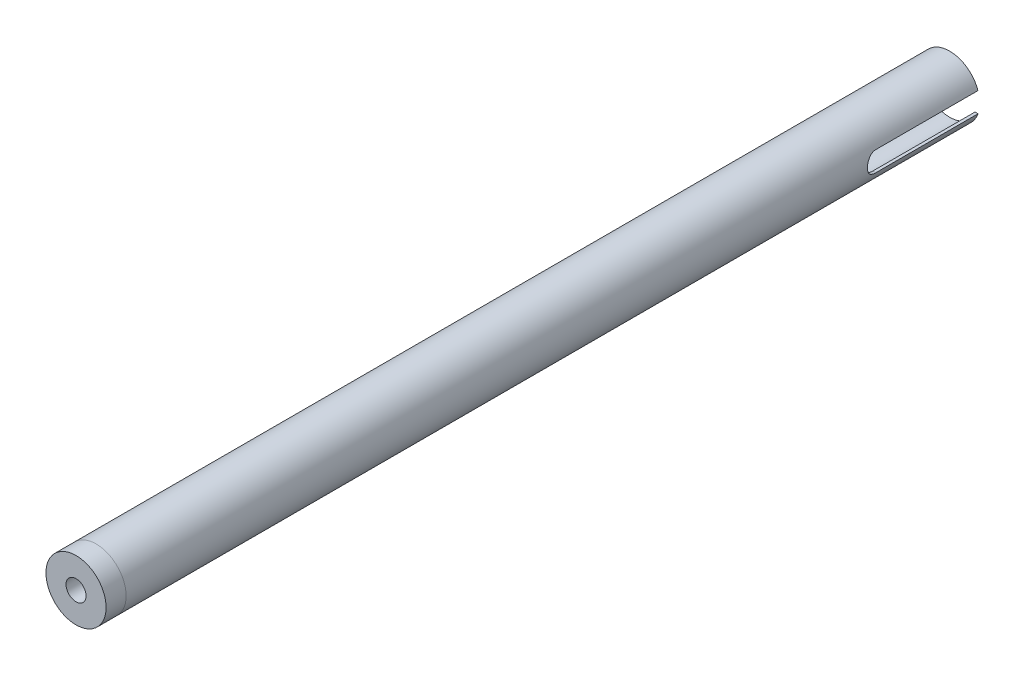
ISO-10303-21;
HEADER;
FILE_DESCRIPTION(('STEP AP214'),'2;1');
FILE_NAME('part.step','',(''),(''),'','','');
FILE_SCHEMA(('AUTOMOTIVE_DESIGN { 1 0 10303 214 1 1 1 1 }'));
ENDSEC;
DATA;
#1=APPLICATION_CONTEXT('core data for automotive mechanical design processes');
#2=APPLICATION_PROTOCOL_DEFINITION('international standard','automotive_design',2000,#1);
#3=PRODUCT_CONTEXT('',#1,'mechanical');
#4=PRODUCT('Part','Part','',(#3));
#5=PRODUCT_RELATED_PRODUCT_CATEGORY('part','',(#4));
#6=PRODUCT_DEFINITION_FORMATION('','',#4);
#7=PRODUCT_DEFINITION_CONTEXT('part definition',#1,'design');
#8=PRODUCT_DEFINITION('design','',#6,#7);
#9=PRODUCT_DEFINITION_SHAPE('','',#8);
#10=(LENGTH_UNIT() NAMED_UNIT(*) SI_UNIT(.MILLI.,.METRE.));
#11=(NAMED_UNIT(*) PLANE_ANGLE_UNIT() SI_UNIT($,.RADIAN.));
#12=(NAMED_UNIT(*) SI_UNIT($,.STERADIAN.) SOLID_ANGLE_UNIT());
#13=UNCERTAINTY_MEASURE_WITH_UNIT(LENGTH_MEASURE(1.E-05),#10,'distance_accuracy_value','');
#14=(GEOMETRIC_REPRESENTATION_CONTEXT(3) GLOBAL_UNCERTAINTY_ASSIGNED_CONTEXT((#13)) GLOBAL_UNIT_ASSIGNED_CONTEXT((#10,
#11,#12)) REPRESENTATION_CONTEXT('',''));
#15=CARTESIAN_POINT('',(0.,0.,0.));
#16=DIRECTION('',(0.,0.,1.));
#17=DIRECTION('',(1.,0.,0.));
#18=AXIS2_PLACEMENT_3D('',#15,#16,#17);
#19=CARTESIAN_POINT('',(0.,0.,-276.704034137088));
#20=DIRECTION('',(0.,0.,1.));
#21=DIRECTION('',(1.,0.,0.));
#22=AXIS2_PLACEMENT_3D('',#19,#20,#21);
#23=CYLINDRICAL_SURFACE('',#22,9.525);
#24=CARTESIAN_POINT('',(0.,0.,-6.35));
#25=DIRECTION('',(0.,0.,1.));
#26=DIRECTION('',(1.,0.,0.));
#27=AXIS2_PLACEMENT_3D('',#24,#25,#26);
#28=CIRCLE('',#27,9.525);
#29=CARTESIAN_POINT('',(9.525,0.,-6.35));
#30=VERTEX_POINT('',#29);
#31=EDGE_CURVE('E167',#30,#30,#28,.T.);
#32=ORIENTED_EDGE('',*,*,#31,.F.);
#33=EDGE_LOOP('',(#32));
#34=FACE_BOUND('',#33,.T.);
#35=CARTESIAN_POINT('',(-8.98025612106915,3.175,-244.319034137088));
#36=CARTESIAN_POINT('',(-8.98024230233901,3.17501142134308,-244.232408033752));
#37=CARTESIAN_POINT('',(-8.98150922759707,3.17145501317748,-244.145789651276));
#38=CARTESIAN_POINT('',(-8.98650170400112,3.1572955094353,-243.973224836451));
#39=CARTESIAN_POINT('',(-8.99022659113085,3.14669431699565,-243.887278228965));
#40=CARTESIAN_POINT('',(-9.00001740508998,3.11857670914846,-243.7169239878));
#41=CARTESIAN_POINT('',(-9.00607621805003,3.10108130380329,-243.632512485993));
#42=CARTESIAN_POINT('',(-9.02033586435303,3.05935434973545,-243.465577684657));
#43=CARTESIAN_POINT('',(-9.02853677497232,3.03512255799513,-243.383054453366));
#44=CARTESIAN_POINT('',(-9.05598792154067,2.95264369348964,-243.139255830089));
#45=CARTESIAN_POINT('',(-9.07810200713862,2.88457148458964,-242.981502245765));
#46=CARTESIAN_POINT('',(-9.127451360236,2.72437908867647,-242.679625727276));
#47=CARTESIAN_POINT('',(-9.15468995097455,2.63224328129309,-242.535511730048));
#48=CARTESIAN_POINT('',(-9.21240416673121,2.42269155952414,-242.259358870223));
#49=CARTESIAN_POINT('',(-9.24296008478943,2.30449853156512,-242.127925288361));
#50=CARTESIAN_POINT('',(-9.30318902123143,2.04784031127145,-241.886329992024));
#51=CARTESIAN_POINT('',(-9.33286185998227,1.90937102786996,-241.776172580792));
#52=CARTESIAN_POINT('',(-9.38892492365178,1.61159672697579,-241.577455569304));
#53=CARTESIAN_POINT('',(-9.41520772598947,1.45183792838569,-241.489543383294));
#54=CARTESIAN_POINT('',(-9.46054712430069,1.11883883316161,-241.342138657224));
#55=CARTESIAN_POINT('',(-9.47961052807859,0.945611424033749,-241.282619329222));
#56=CARTESIAN_POINT('',(-9.50410661247238,0.642992499572345,-241.207140564727));
#57=CARTESIAN_POINT('',(-9.51189798251809,0.515662964135989,-241.183522592684));
#58=CARTESIAN_POINT('',(-9.51973491912187,0.323120458247677,-241.15985632651));
#59=CARTESIAN_POINT('',(-9.52170555244691,0.258670486244967,-241.153927678894));
#60=CARTESIAN_POINT('',(-9.52433958502699,0.129484930346638,-241.146015054227));
#61=CARTESIAN_POINT('',(-9.5250026318504,0.0647492741617516,-241.144032140662));
#62=CARTESIAN_POINT('',(-9.525,0.,-241.144034137088));
#63=B_SPLINE_CURVE_WITH_KNOTS('',3,(#35,#36,#37,#38,#39,#40,#41,#42,#43,#44,#45,#46,#47,#48,#49,
#50,#51,#52,#53,#54,#55,#56,#57,#58,#59,#60,#61,#62),.UNSPECIFIED.,.F.,.F.,(4,2,2,2,2,2,2,2,2,2,
2,2,2,4),(0.,0.259783027985017,0.519495904525387,0.778423354079382,1.0373601457496,
1.55448370709136,2.07194378605916,2.60765740005747,3.14347925237351,3.69345572792677,
4.24291228331232,4.63105001394517,4.8251849841295,5.01937227204627),.UNSPECIFIED.);
#64=CARTESIAN_POINT('',(-8.98025612106915,3.175,-244.319034137088));
#65=VERTEX_POINT('',#64);
#66=CARTESIAN_POINT('',(-9.525,0.,-241.144034137088));
#67=VERTEX_POINT('',#66);
#68=EDGE_CURVE('E194',#65,#67,#63,.T.);
#69=ORIENTED_EDGE('',*,*,#68,.T.);
#70=CARTESIAN_POINT('',(-9.525,0.,-241.144034137088));
#71=CARTESIAN_POINT('',(-9.52501110102584,-0.0867614879611003,-241.144023032051));
#72=CARTESIAN_POINT('',(-9.52381482114642,-0.173516026970682,-241.147590243708));
#73=CARTESIAN_POINT('',(-9.51909010104991,-0.346361025979099,-241.16179508229));
#74=CARTESIAN_POINT('',(-9.51556219632442,-0.432451633867615,-241.172431085767));
#75=CARTESIAN_POINT('',(-9.50626969526085,-0.603121388983422,-241.200648077281));
#76=CARTESIAN_POINT('',(-9.50051134567603,-0.687704073408633,-241.21820967145));
#77=CARTESIAN_POINT('',(-9.48692170416637,-0.854983898510568,-241.260100992087));
#78=CARTESIAN_POINT('',(-9.47909035815865,-0.937680989932476,-241.284430895137));
#79=CARTESIAN_POINT('',(-9.45278540829331,-1.18202731628103,-241.367265288075));
#80=CARTESIAN_POINT('',(-9.43148823554423,-1.3401498669332,-241.435650969421));
#81=CARTESIAN_POINT('',(-9.38354405256208,-1.64264414222568,-241.596577495197));
#82=CARTESIAN_POINT('',(-9.35689419571071,-1.78700848960573,-241.689131200351));
#83=CARTESIAN_POINT('',(-9.30002401422067,-2.06291632995429,-241.899124628556));
#84=CARTESIAN_POINT('',(-9.26971861159363,-2.19392359690275,-242.017246913975));
#85=CARTESIAN_POINT('',(-9.20941732427212,-2.43468689521898,-242.27358489081));
#86=CARTESIAN_POINT('',(-9.1794215361322,-2.54443647619592,-242.411806658968));
#87=CARTESIAN_POINT('',(-9.122187697517,-2.74268087840455,-242.709314638016));
#88=CARTESIAN_POINT('',(-9.09505529775998,-2.83046425019683,-242.869096776089));
#89=CARTESIAN_POINT('',(-9.04794936227173,-2.97762337182932,-243.202141098094));
#90=CARTESIAN_POINT('',(-9.0279682579705,-3.03702917747986,-243.375388792902));
#91=CARTESIAN_POINT('',(-9.00226999890487,-3.11221256504251,-243.677675826897));
#92=CARTESIAN_POINT('',(-8.99408207355733,-3.13569679171672,-243.804638148324));
#93=CARTESIAN_POINT('',(-8.98304472933549,-3.16711304593222,-244.060715320093));
#94=CARTESIAN_POINT('',(-8.98019613476149,-3.17504267212105,-244.189830499695));
#95=CARTESIAN_POINT('',(-8.98025612106915,-3.175,-244.319034137088));
#96=B_SPLINE_CURVE_WITH_KNOTS('',3,(#70,#71,#72,#73,#74,#75,#76,#77,#78,#79,#80,#81,#82,#83,#84,
#85,#86,#87,#88,#89,#90,#91,#92,#93,#94,#95),.UNSPECIFIED.,.F.,.F.,(4,2,2,2,2,2,2,2,2,2,2,2,4),
(0.,0.260191091827301,0.520322447737218,0.779730467212509,1.03914525511039,1.55731822615722,
2.07576750062864,2.61028978360819,3.14497400776477,3.69521752133767,4.24487695078963,
4.63199348452993,5.01916977744545),.UNSPECIFIED.);
#97=CARTESIAN_POINT('',(-8.98025612106916,-3.175,-244.319034137088));
#98=VERTEX_POINT('',#97);
#99=EDGE_CURVE('E146',#67,#98,#96,.T.);
#100=ORIENTED_EDGE('',*,*,#99,.T.);
#101=DIRECTION('',(0.,0.,-1.));
#102=VECTOR('',#101,1.);
#103=CARTESIAN_POINT('',(-8.98025612106916,-3.175,-241.144034137088));
#104=LINE('',#103,#102);
#105=CARTESIAN_POINT('',(-8.98025612106916,-3.175,-276.704034137088));
#106=VERTEX_POINT('',#105);
#107=EDGE_CURVE('E141',#98,#106,#104,.T.);
#108=ORIENTED_EDGE('',*,*,#107,.T.);
#109=CARTESIAN_POINT('',(0.,0.,-276.704034137088));
#110=DIRECTION('',(0.,0.,1.));
#111=DIRECTION('',(1.,0.,0.));
#112=AXIS2_PLACEMENT_3D('',#109,#110,#111);
#113=CIRCLE('',#112,9.525);
#114=CARTESIAN_POINT('',(8.98025612106915,-3.175,-276.704034137088));
#115=VERTEX_POINT('',#114);
#116=EDGE_CURVE('E144',#106,#115,#113,.T.);
#117=ORIENTED_EDGE('',*,*,#116,.T.);
#118=DIRECTION('',(0.,0.,-1.));
#119=VECTOR('',#118,1.);
#120=CARTESIAN_POINT('',(8.98025612106915,-3.175,-241.144034137088));
#121=LINE('',#120,#119);
#122=CARTESIAN_POINT('',(8.98025612106915,-3.175,-244.319034137088));
#123=VERTEX_POINT('',#122);
#124=EDGE_CURVE('E427',#123,#115,#121,.T.);
#125=ORIENTED_EDGE('',*,*,#124,.F.);
#126=CARTESIAN_POINT('',(8.98025612106915,-3.175,-244.319034137088));
#127=CARTESIAN_POINT('',(8.98024230233901,-3.17501142134308,-244.232408033752));
#128=CARTESIAN_POINT('',(8.98150922759707,-3.17145501317748,-244.145789651276));
#129=CARTESIAN_POINT('',(8.98650170400112,-3.1572955094353,-243.973224836451));
#130=CARTESIAN_POINT('',(8.99022659113085,-3.14669431699565,-243.887278228965));
#131=CARTESIAN_POINT('',(9.00001740508998,-3.11857670914846,-243.7169239878));
#132=CARTESIAN_POINT('',(9.00607621805003,-3.10108130380329,-243.632512485993));
#133=CARTESIAN_POINT('',(9.02033586435303,-3.05935434973545,-243.465577684657));
#134=CARTESIAN_POINT('',(9.02853677497232,-3.03512255799513,-243.383054453366));
#135=CARTESIAN_POINT('',(9.05598792154067,-2.95264369348964,-243.139255830089));
#136=CARTESIAN_POINT('',(9.07810200713862,-2.88457148458964,-242.981502245765));
#137=CARTESIAN_POINT('',(9.127451360236,-2.72437908867647,-242.679625727276));
#138=CARTESIAN_POINT('',(9.15468995097455,-2.63224328129309,-242.535511730048));
#139=CARTESIAN_POINT('',(9.21240416673121,-2.42269155952414,-242.259358870223));
#140=CARTESIAN_POINT('',(9.24296008478943,-2.30449853156512,-242.127925288361));
#141=CARTESIAN_POINT('',(9.30318902123143,-2.04784031127145,-241.886329992024));
#142=CARTESIAN_POINT('',(9.33286185998227,-1.90937102786996,-241.776172580792));
#143=CARTESIAN_POINT('',(9.38892492365178,-1.61159672697579,-241.577455569304));
#144=CARTESIAN_POINT('',(9.41520772598947,-1.45183792838569,-241.489543383294));
#145=CARTESIAN_POINT('',(9.46054712430069,-1.11883883316161,-241.342138657224));
#146=CARTESIAN_POINT('',(9.47961052807859,-0.945611424033749,-241.282619329222));
#147=CARTESIAN_POINT('',(9.50410661247238,-0.642992499572345,-241.207140564727));
#148=CARTESIAN_POINT('',(9.51189798251809,-0.515662964135989,-241.183522592684));
#149=CARTESIAN_POINT('',(9.51973491912187,-0.323120458247677,-241.15985632651));
#150=CARTESIAN_POINT('',(9.52170555244691,-0.258670486244967,-241.153927678894));
#151=CARTESIAN_POINT('',(9.52433958502699,-0.129484930346638,-241.146015054227));
#152=CARTESIAN_POINT('',(9.5250026318504,-0.0647492741617516,-241.144032140662));
#153=CARTESIAN_POINT('',(9.525,0.,-241.144034137088));
#154=B_SPLINE_CURVE_WITH_KNOTS('',3,(#126,#127,#128,#129,#130,#131,#132,#133,#134,#135,#136,
#137,#138,#139,#140,#141,#142,#143,#144,#145,#146,#147,#148,#149,#150,#151,#152,#153),
.UNSPECIFIED.,.F.,.F.,(4,2,2,2,2,2,2,2,2,2,2,2,2,4),(0.,0.259783027985017,0.519495904525387,
0.778423354079382,1.0373601457496,1.55448370709136,2.07194378605916,2.60765740005747,
3.14347925237351,3.69345572792677,4.24291228331232,4.63105001394517,4.8251849841295,
5.01937227204627),.UNSPECIFIED.);
#155=CARTESIAN_POINT('',(9.525,0.,-241.144034137088));
#156=VERTEX_POINT('',#155);
#157=EDGE_CURVE('E87',#123,#156,#154,.T.);
#158=ORIENTED_EDGE('',*,*,#157,.T.);
#159=CARTESIAN_POINT('',(9.525,0.,-241.144034137088));
#160=CARTESIAN_POINT('',(9.52501110102584,0.0867614879611003,-241.144023032051));
#161=CARTESIAN_POINT('',(9.52381482114642,0.173516026970682,-241.147590243708));
#162=CARTESIAN_POINT('',(9.51909010104991,0.346361025979099,-241.16179508229));
#163=CARTESIAN_POINT('',(9.51556219632442,0.432451633867615,-241.172431085767));
#164=CARTESIAN_POINT('',(9.50626969526085,0.603121388983422,-241.200648077281));
#165=CARTESIAN_POINT('',(9.50051134567603,0.687704073408633,-241.21820967145));
#166=CARTESIAN_POINT('',(9.48692170416637,0.854983898510568,-241.260100992087));
#167=CARTESIAN_POINT('',(9.47909035815865,0.937680989932476,-241.284430895137));
#168=CARTESIAN_POINT('',(9.45278540829331,1.18202731628103,-241.367265288075));
#169=CARTESIAN_POINT('',(9.43148823554423,1.3401498669332,-241.435650969421));
#170=CARTESIAN_POINT('',(9.38354405256208,1.64264414222568,-241.596577495197));
#171=CARTESIAN_POINT('',(9.35689419571071,1.78700848960573,-241.689131200351));
#172=CARTESIAN_POINT('',(9.30002401422067,2.06291632995429,-241.899124628556));
#173=CARTESIAN_POINT('',(9.26971861159363,2.19392359690275,-242.017246913975));
#174=CARTESIAN_POINT('',(9.20941732427212,2.43468689521898,-242.27358489081));
#175=CARTESIAN_POINT('',(9.1794215361322,2.54443647619592,-242.411806658968));
#176=CARTESIAN_POINT('',(9.122187697517,2.74268087840455,-242.709314638016));
#177=CARTESIAN_POINT('',(9.09505529775998,2.83046425019683,-242.869096776089));
#178=CARTESIAN_POINT('',(9.04794936227173,2.97762337182932,-243.202141098094));
#179=CARTESIAN_POINT('',(9.0279682579705,3.03702917747986,-243.375388792902));
#180=CARTESIAN_POINT('',(9.00226999890487,3.11221256504251,-243.677675826897));
#181=CARTESIAN_POINT('',(8.99408207355733,3.13569679171672,-243.804638148324));
#182=CARTESIAN_POINT('',(8.98304472933549,3.16711304593222,-244.060715320093));
#183=CARTESIAN_POINT('',(8.98019613476149,3.17504267212105,-244.189830499695));
#184=CARTESIAN_POINT('',(8.98025612106915,3.175,-244.319034137088));
#185=B_SPLINE_CURVE_WITH_KNOTS('',3,(#159,#160,#161,#162,#163,#164,#165,#166,#167,#168,#169,
#170,#171,#172,#173,#174,#175,#176,#177,#178,#179,#180,#181,#182,#183,#184),.UNSPECIFIED.,.F.,
.F.,(4,2,2,2,2,2,2,2,2,2,2,2,4),(0.,0.260191091827301,0.520322447737218,0.779730467212509,
1.03914525511039,1.55731822615722,2.07576750062864,2.61028978360819,3.14497400776477,
3.69521752133767,4.24487695078963,4.63199348452993,5.01916977744545),.UNSPECIFIED.);
#186=CARTESIAN_POINT('',(8.98025612106915,3.175,-244.319034137088));
#187=VERTEX_POINT('',#186);
#188=EDGE_CURVE('E73',#156,#187,#185,.T.);
#189=ORIENTED_EDGE('',*,*,#188,.T.);
#190=DIRECTION('',(0.,0.,-1.));
#191=VECTOR('',#190,1.);
#192=CARTESIAN_POINT('',(8.98025612106915,3.175,-241.144034137088));
#193=LINE('',#192,#191);
#194=CARTESIAN_POINT('',(8.98025612106915,3.175,-276.704034137088));
#195=VERTEX_POINT('',#194);
#196=EDGE_CURVE('E160',#187,#195,#193,.T.);
#197=ORIENTED_EDGE('',*,*,#196,.T.);
#198=CARTESIAN_POINT('',(-8.98025612106915,3.175,-276.704034137088));
#199=VERTEX_POINT('',#198);
#200=EDGE_CURVE('E166',#195,#199,#113,.T.);
#201=ORIENTED_EDGE('',*,*,#200,.T.);
#202=DIRECTION('',(0.,0.,-1.));
#203=VECTOR('',#202,1.);
#204=CARTESIAN_POINT('',(-8.98025612106915,3.175,-241.144034137088));
#205=LINE('',#204,#203);
#206=EDGE_CURVE('E420',#65,#199,#205,.T.);
#207=ORIENTED_EDGE('',*,*,#206,.F.);
#208=EDGE_LOOP('',(#69,#100,#108,#117,#125,#158,#189,#197,#201,#207));
#209=FACE_BOUND('',#208,.T.);
#210=ADVANCED_FACE('F63',(#34,#209),#23,.T.);
#211=CARTESIAN_POINT('',(0.,0.,-276.704034137088));
#212=DIRECTION('',(0.,0.,1.));
#213=DIRECTION('',(1.,0.,0.));
#214=AXIS2_PLACEMENT_3D('',#211,#212,#213);
#215=PLANE('',#214);
#216=DIRECTION('',(1.,0.,0.));
#217=VECTOR('',#216,1.);
#218=CARTESIAN_POINT('',(0.,-3.175,-276.704034137088));
#219=LINE('',#218,#217);
#220=CARTESIAN_POINT('',(-8.03118117091129,-3.175,-276.704034137088));
#221=VERTEX_POINT('',#220);
#222=EDGE_CURVE('E153',#106,#221,#219,.T.);
#223=ORIENTED_EDGE('',*,*,#222,.T.);
#224=CARTESIAN_POINT('',(0.,0.,-276.704034137088));
#225=DIRECTION('',(0.,0.,1.));
#226=DIRECTION('',(1.,0.,0.));
#227=AXIS2_PLACEMENT_3D('',#224,#225,#226);
#228=CIRCLE('',#227,8.636);
#229=CARTESIAN_POINT('',(8.03118117091129,-3.175,-276.704034137088));
#230=VERTEX_POINT('',#229);
#231=EDGE_CURVE('E275',#221,#230,#228,.T.);
#232=ORIENTED_EDGE('',*,*,#231,.T.);
#233=DIRECTION('',(1.,0.,0.));
#234=VECTOR('',#233,1.);
#235=CARTESIAN_POINT('',(0.,-3.175,-276.704034137088));
#236=LINE('',#235,#234);
#237=EDGE_CURVE('E165',#230,#115,#236,.T.);
#238=ORIENTED_EDGE('',*,*,#237,.T.);
#239=ORIENTED_EDGE('',*,*,#116,.F.);
#240=EDGE_LOOP('',(#223,#232,#238,#239));
#241=FACE_BOUND('',#240,.T.);
#242=ADVANCED_FACE('F163',(#241),#215,.F.);
#243=CARTESIAN_POINT('',(0.,0.,-276.704034137088));
#244=DIRECTION('',(0.,0.,1.));
#245=DIRECTION('',(1.,0.,0.));
#246=AXIS2_PLACEMENT_3D('',#243,#244,#245);
#247=CYLINDRICAL_SURFACE('',#246,8.636);
#248=CARTESIAN_POINT('',(0.,0.,-6.35));
#249=DIRECTION('',(0.,0.,1.));
#250=DIRECTION('',(1.,0.,0.));
#251=AXIS2_PLACEMENT_3D('',#248,#249,#250);
#252=CIRCLE('',#251,8.636);
#253=CARTESIAN_POINT('',(8.636,0.,-6.35));
#254=VERTEX_POINT('',#253);
#255=EDGE_CURVE('E149',#254,#254,#252,.T.);
#256=ORIENTED_EDGE('',*,*,#255,.T.);
#257=EDGE_LOOP('',(#256));
#258=FACE_BOUND('',#257,.T.);
#259=DIRECTION('',(0.,0.,-1.));
#260=VECTOR('',#259,1.);
#261=CARTESIAN_POINT('',(-8.03118117091129,-3.175,-241.144034137088));
#262=LINE('',#261,#260);
#263=CARTESIAN_POINT('',(-8.03118117091129,-3.175,-244.319034137088));
#264=VERTEX_POINT('',#263);
#265=EDGE_CURVE('E150',#264,#221,#262,.T.);
#266=ORIENTED_EDGE('',*,*,#265,.F.);
#267=CARTESIAN_POINT('',(-8.03118117091129,-3.175,-244.319034137088));
#268=CARTESIAN_POINT('',(-8.03116550357192,-3.17501203663229,-244.232999168972));
#269=CARTESIAN_POINT('',(-8.03256328665433,-3.17150327993898,-244.146972816443));
#270=CARTESIAN_POINT('',(-8.03806891362409,-3.15753809299539,-243.975600245974));
#271=CARTESIAN_POINT('',(-8.04217588089715,-3.147083910078,-243.890253817068));
#272=CARTESIAN_POINT('',(-8.05296421917626,-3.11937037021479,-243.721144682852));
#273=CARTESIAN_POINT('',(-8.05963650808002,-3.10213501593151,-243.63737747191));
#274=CARTESIAN_POINT('',(-8.07533202922414,-3.06104389654163,-243.471728509142));
#275=CARTESIAN_POINT('',(-8.08435537430867,-3.03718781365489,-243.389846848023));
#276=CARTESIAN_POINT('',(-8.11453837074661,-2.95603278100126,-243.147994690778));
#277=CARTESIAN_POINT('',(-8.13883087950845,-2.88909903597751,-242.991528053203));
#278=CARTESIAN_POINT('',(-8.19300406693487,-2.7316794881875,-242.691993064078));
#279=CARTESIAN_POINT('',(-8.2228893144862,-2.64117440539559,-242.548935811521));
#280=CARTESIAN_POINT('',(-8.28646461334555,-2.43457537576573,-242.273465402283));
#281=CARTESIAN_POINT('',(-8.32026315150129,-2.31754645569598,-242.141777030196));
#282=CARTESIAN_POINT('',(-8.38695072719909,-2.06320558041452,-241.899388851802));
#283=CARTESIAN_POINT('',(-8.41983956911545,-1.92588930215217,-241.788693530432));
#284=CARTESIAN_POINT('',(-8.48230406273647,-1.62932475427475,-241.587912415482));
#285=CARTESIAN_POINT('',(-8.51173519592471,-1.46950375402868,-241.498624061976));
#286=CARTESIAN_POINT('',(-8.56262575627031,-1.13591027783605,-241.348561909013));
#287=CARTESIAN_POINT('',(-8.58409342507971,-0.962152453429188,-241.287758612193));
#288=CARTESIAN_POINT('',(-8.61197450421745,-0.656412542712551,-241.209834246543));
#289=CARTESIAN_POINT('',(-8.62092967235125,-0.52653821034923,-241.185218462205));
#290=CARTESIAN_POINT('',(-8.62994176115801,-0.33002097693849,-241.160541130489));
#291=CARTESIAN_POINT('',(-8.63220903333297,-0.264206342476339,-241.154356391339));
#292=CARTESIAN_POINT('',(-8.63523992352765,-0.132266265743968,-241.146101175893));
#293=CARTESIAN_POINT('',(-8.6360031097792,-0.0661407396870625,-241.14403188099));
#294=CARTESIAN_POINT('',(-8.636,0.,-241.144034137088));
#295=B_SPLINE_CURVE_WITH_KNOTS('',3,(#267,#268,#269,#270,#271,#272,#273,#274,#275,#276,#277,
#278,#279,#280,#281,#282,#283,#284,#285,#286,#287,#288,#289,#290,#291,#292,#293,#294),
.UNSPECIFIED.,.F.,.F.,(4,2,2,2,2,2,2,2,2,2,2,2,2,4),(0.,0.258007583993629,0.515931725057033,
0.772951013405609,1.02998264023841,1.54317615093285,2.05679075055087,2.59254838663383,
3.12842035287703,3.68191422398172,4.23483365719867,4.63113823379686,4.8294369210689,
5.02779252437178),.UNSPECIFIED.);
#296=CARTESIAN_POINT('',(-8.636,0.,-241.144034137088));
#297=VERTEX_POINT('',#296);
#298=EDGE_CURVE('E221',#264,#297,#295,.T.);
#299=ORIENTED_EDGE('',*,*,#298,.T.);
#300=CARTESIAN_POINT('',(-8.636,0.,-241.144034137088));
#301=CARTESIAN_POINT('',(-8.63601200177566,0.086234054502865,-241.144022563365));
#302=CARTESIAN_POINT('',(-8.63470866649585,0.172460638964014,-241.147547103385));
#303=CARTESIAN_POINT('',(-8.62956076290727,0.34424536862396,-241.161578533015));
#304=CARTESIAN_POINT('',(-8.62571686385256,0.429803683858972,-241.172083583771));
#305=CARTESIAN_POINT('',(-8.61559314175803,0.599377201936824,-241.199942337826));
#306=CARTESIAN_POINT('',(-8.60932102288695,0.683396413719316,-241.217274383682));
#307=CARTESIAN_POINT('',(-8.5945171663722,0.84955353944947,-241.258605606958));
#308=CARTESIAN_POINT('',(-8.58598535382315,0.931691390934835,-241.282605005391));
#309=CARTESIAN_POINT('',(-8.55732464851214,1.17435074221828,-241.364279186829));
#310=CARTESIAN_POINT('',(-8.53411500636261,1.33136171263577,-241.431670507795));
#311=CARTESIAN_POINT('',(-8.48180653117632,1.63181198358794,-241.590162217805));
#312=CARTESIAN_POINT('',(-8.45270389942466,1.77524244193608,-241.681277910842));
#313=CARTESIAN_POINT('',(-8.39029834803106,2.05036661398533,-241.88853102852));
#314=CARTESIAN_POINT('',(-8.35688032192871,2.18143474113562,-242.005465396112));
#315=CARTESIAN_POINT('',(-8.29018507770489,2.42260670191497,-242.259354382569));
#316=CARTESIAN_POINT('',(-8.25690791509208,2.53270290926751,-242.396316252399));
#317=CARTESIAN_POINT('',(-8.19291826363247,2.73277128594143,-242.692481341224));
#318=CARTESIAN_POINT('',(-8.16234475412033,2.82185641770733,-242.852316430661));
#319=CARTESIAN_POINT('',(-8.10906121054024,2.97153048258985,-243.185911774163));
#320=CARTESIAN_POINT('',(-8.08634169503735,3.03215380703845,-243.359654923832));
#321=CARTESIAN_POINT('',(-8.05677760160867,3.10966172606007,-243.664923558645));
#322=CARTESIAN_POINT('',(-8.04725077861386,3.13409804308656,-243.794304277851));
#323=CARTESIAN_POINT('',(-8.03764862425496,3.15860280233702,-243.990111403691));
#324=CARTESIAN_POINT('',(-8.0352292163598,3.16474613160122,-244.055704159997));
#325=CARTESIAN_POINT('',(-8.03199317651195,3.17294655384153,-244.187204112387));
#326=CARTESIAN_POINT('',(-8.03117703985816,3.17500238406813,-244.253111399337));
#327=CARTESIAN_POINT('',(-8.03118117091129,3.175,-244.319034137088));
#328=B_SPLINE_CURVE_WITH_KNOTS('',3,(#300,#301,#302,#303,#304,#305,#306,#307,#308,#309,#310,
#311,#312,#313,#314,#315,#316,#317,#318,#319,#320,#321,#322,#323,#324,#325,#326,#327),
.UNSPECIFIED.,.F.,.F.,(4,2,2,2,2,2,2,2,2,2,2,2,2,4),(0.,0.258607684277236,0.517147271349145,
0.774873208333403,1.0326076896076,1.54734347080468,2.06241212125686,2.59642224394463,
3.13062618611959,3.68443916069367,4.237581211598,4.63245186558866,4.83009172977029,
5.02779264127874),.UNSPECIFIED.);
#329=CARTESIAN_POINT('',(-8.03118117091129,3.175,-244.319034137088));
#330=VERTEX_POINT('',#329);
#331=EDGE_CURVE('E186',#297,#330,#328,.T.);
#332=ORIENTED_EDGE('',*,*,#331,.T.);
#333=DIRECTION('',(0.,0.,-1.));
#334=VECTOR('',#333,1.);
#335=CARTESIAN_POINT('',(-8.03118117091129,3.175,-241.144034137088));
#336=LINE('',#335,#334);
#337=CARTESIAN_POINT('',(-8.03118117091129,3.175,-276.704034137088));
#338=VERTEX_POINT('',#337);
#339=EDGE_CURVE('E417',#330,#338,#336,.T.);
#340=ORIENTED_EDGE('',*,*,#339,.T.);
#341=CARTESIAN_POINT('',(8.03118117091129,3.175,-276.704034137088));
#342=VERTEX_POINT('',#341);
#343=EDGE_CURVE('E172',#342,#338,#228,.T.);
#344=ORIENTED_EDGE('',*,*,#343,.F.);
#345=DIRECTION('',(0.,0.,-1.));
#346=VECTOR('',#345,1.);
#347=CARTESIAN_POINT('',(8.03118117091129,3.175,-241.144034137088));
#348=LINE('',#347,#346);
#349=CARTESIAN_POINT('',(8.03118117091129,3.175,-244.319034137088));
#350=VERTEX_POINT('',#349);
#351=EDGE_CURVE('E269',#350,#342,#348,.T.);
#352=ORIENTED_EDGE('',*,*,#351,.F.);
#353=CARTESIAN_POINT('',(8.03118117091129,3.175,-244.319034137088));
#354=CARTESIAN_POINT('',(8.03116550357192,3.17501203663229,-244.232999168972));
#355=CARTESIAN_POINT('',(8.03256328665433,3.17150327993898,-244.146972816443));
#356=CARTESIAN_POINT('',(8.03806891362409,3.15753809299539,-243.975600245974));
#357=CARTESIAN_POINT('',(8.04217588089715,3.147083910078,-243.890253817068));
#358=CARTESIAN_POINT('',(8.05296421917626,3.11937037021479,-243.721144682852));
#359=CARTESIAN_POINT('',(8.05963650808002,3.10213501593151,-243.63737747191));
#360=CARTESIAN_POINT('',(8.07533202922414,3.06104389654163,-243.471728509142));
#361=CARTESIAN_POINT('',(8.08435537430867,3.03718781365489,-243.389846848023));
#362=CARTESIAN_POINT('',(8.11453837074661,2.95603278100126,-243.147994690778));
#363=CARTESIAN_POINT('',(8.13883087950845,2.88909903597751,-242.991528053203));
#364=CARTESIAN_POINT('',(8.19300406693487,2.7316794881875,-242.691993064078));
#365=CARTESIAN_POINT('',(8.2228893144862,2.64117440539559,-242.548935811521));
#366=CARTESIAN_POINT('',(8.28646461334555,2.43457537576573,-242.273465402283));
#367=CARTESIAN_POINT('',(8.32026315150129,2.31754645569598,-242.141777030196));
#368=CARTESIAN_POINT('',(8.38695072719909,2.06320558041452,-241.899388851802));
#369=CARTESIAN_POINT('',(8.41983956911545,1.92588930215217,-241.788693530432));
#370=CARTESIAN_POINT('',(8.48230406273647,1.62932475427475,-241.587912415482));
#371=CARTESIAN_POINT('',(8.51173519592471,1.46950375402868,-241.498624061976));
#372=CARTESIAN_POINT('',(8.56262575627031,1.13591027783605,-241.348561909013));
#373=CARTESIAN_POINT('',(8.58409342507971,0.962152453429188,-241.287758612193));
#374=CARTESIAN_POINT('',(8.61197450421745,0.656412542712551,-241.209834246543));
#375=CARTESIAN_POINT('',(8.62092967235125,0.52653821034923,-241.185218462205));
#376=CARTESIAN_POINT('',(8.62994176115801,0.33002097693849,-241.160541130489));
#377=CARTESIAN_POINT('',(8.63220903333297,0.264206342476339,-241.154356391339));
#378=CARTESIAN_POINT('',(8.63523992352765,0.132266265743968,-241.146101175893));
#379=CARTESIAN_POINT('',(8.6360031097792,0.0661407396870625,-241.14403188099));
#380=CARTESIAN_POINT('',(8.636,0.,-241.144034137088));
#381=B_SPLINE_CURVE_WITH_KNOTS('',3,(#353,#354,#355,#356,#357,#358,#359,#360,#361,#362,#363,
#364,#365,#366,#367,#368,#369,#370,#371,#372,#373,#374,#375,#376,#377,#378,#379,#380),
.UNSPECIFIED.,.F.,.F.,(4,2,2,2,2,2,2,2,2,2,2,2,2,4),(0.,0.258007583993629,0.515931725057033,
0.772951013405609,1.02998264023841,1.54317615093285,2.05679075055087,2.59254838663383,
3.12842035287703,3.68191422398172,4.23483365719867,4.63113823379686,4.8294369210689,
5.02779252437178),.UNSPECIFIED.);
#382=CARTESIAN_POINT('',(8.636,0.,-241.144034137088));
#383=VERTEX_POINT('',#382);
#384=EDGE_CURVE('E13',#350,#383,#381,.T.);
#385=ORIENTED_EDGE('',*,*,#384,.T.);
#386=CARTESIAN_POINT('',(8.636,0.,-241.144034137088));
#387=CARTESIAN_POINT('',(8.63601200177566,-0.086234054502865,-241.144022563365));
#388=CARTESIAN_POINT('',(8.63470866649585,-0.172460638964014,-241.147547103385));
#389=CARTESIAN_POINT('',(8.62956076290727,-0.34424536862396,-241.161578533015));
#390=CARTESIAN_POINT('',(8.62571686385256,-0.429803683858972,-241.172083583771));
#391=CARTESIAN_POINT('',(8.61559314175803,-0.599377201936824,-241.199942337826));
#392=CARTESIAN_POINT('',(8.60932102288695,-0.683396413719316,-241.217274383682));
#393=CARTESIAN_POINT('',(8.5945171663722,-0.84955353944947,-241.258605606958));
#394=CARTESIAN_POINT('',(8.58598535382315,-0.931691390934835,-241.282605005391));
#395=CARTESIAN_POINT('',(8.55732464851214,-1.17435074221828,-241.364279186829));
#396=CARTESIAN_POINT('',(8.53411500636261,-1.33136171263577,-241.431670507795));
#397=CARTESIAN_POINT('',(8.48180653117632,-1.63181198358794,-241.590162217805));
#398=CARTESIAN_POINT('',(8.45270389942466,-1.77524244193608,-241.681277910842));
#399=CARTESIAN_POINT('',(8.39029834803106,-2.05036661398533,-241.88853102852));
#400=CARTESIAN_POINT('',(8.35688032192871,-2.18143474113562,-242.005465396112));
#401=CARTESIAN_POINT('',(8.29018507770489,-2.42260670191497,-242.259354382569));
#402=CARTESIAN_POINT('',(8.25690791509208,-2.53270290926751,-242.396316252399));
#403=CARTESIAN_POINT('',(8.19291826363247,-2.73277128594143,-242.692481341224));
#404=CARTESIAN_POINT('',(8.16234475412033,-2.82185641770733,-242.852316430661));
#405=CARTESIAN_POINT('',(8.10906121054024,-2.97153048258985,-243.185911774163));
#406=CARTESIAN_POINT('',(8.08634169503735,-3.03215380703845,-243.359654923832));
#407=CARTESIAN_POINT('',(8.05677760160867,-3.10966172606007,-243.664923558645));
#408=CARTESIAN_POINT('',(8.04725077861386,-3.13409804308656,-243.794304277851));
#409=CARTESIAN_POINT('',(8.03764862425496,-3.15860280233702,-243.990111403691));
#410=CARTESIAN_POINT('',(8.0352292163598,-3.16474613160122,-244.055704159997));
#411=CARTESIAN_POINT('',(8.03199317651195,-3.17294655384153,-244.187204112387));
#412=CARTESIAN_POINT('',(8.03117703985816,-3.17500238406813,-244.253111399337));
#413=CARTESIAN_POINT('',(8.03118117091129,-3.175,-244.319034137088));
#414=B_SPLINE_CURVE_WITH_KNOTS('',3,(#386,#387,#388,#389,#390,#391,#392,#393,#394,#395,#396,
#397,#398,#399,#400,#401,#402,#403,#404,#405,#406,#407,#408,#409,#410,#411,#412,#413),
.UNSPECIFIED.,.F.,.F.,(4,2,2,2,2,2,2,2,2,2,2,2,2,4),(0.,0.258607684277236,0.517147271349145,
0.774873208333403,1.0326076896076,1.54734347080468,2.06241212125686,2.59642224394463,
3.13062618611959,3.68443916069367,4.237581211598,4.63245186558866,4.83009172977029,
5.02779264127874),.UNSPECIFIED.);
#415=CARTESIAN_POINT('',(8.03118117091129,-3.175,-244.319034137088));
#416=VERTEX_POINT('',#415);
#417=EDGE_CURVE('E237',#383,#416,#414,.T.);
#418=ORIENTED_EDGE('',*,*,#417,.T.);
#419=DIRECTION('',(0.,0.,-1.));
#420=VECTOR('',#419,1.);
#421=CARTESIAN_POINT('',(8.03118117091129,-3.175,-241.144034137088));
#422=LINE('',#421,#420);
#423=EDGE_CURVE('E271',#416,#230,#422,.T.);
#424=ORIENTED_EDGE('',*,*,#423,.T.);
#425=ORIENTED_EDGE('',*,*,#231,.F.);
#426=EDGE_LOOP('',(#266,#299,#332,#340,#344,#352,#385,#418,#424,#425));
#427=FACE_BOUND('',#426,.T.);
#428=ADVANCED_FACE('F201',(#258,#427),#247,.F.);
#429=ORIENTED_EDGE('',*,*,#343,.T.);
#430=DIRECTION('',(1.,0.,0.));
#431=VECTOR('',#430,1.);
#432=CARTESIAN_POINT('',(0.,3.175,-276.704034137088));
#433=LINE('',#432,#431);
#434=EDGE_CURVE('E159',#199,#338,#433,.T.);
#435=ORIENTED_EDGE('',*,*,#434,.F.);
#436=ORIENTED_EDGE('',*,*,#200,.F.);
#437=DIRECTION('',(1.,0.,0.));
#438=VECTOR('',#437,1.);
#439=CARTESIAN_POINT('',(0.,3.175,-276.704034137088));
#440=LINE('',#439,#438);
#441=EDGE_CURVE('E253',#342,#195,#440,.T.);
#442=ORIENTED_EDGE('',*,*,#441,.F.);
#443=EDGE_LOOP('',(#429,#435,#436,#442));
#444=FACE_BOUND('',#443,.T.);
#445=ADVANCED_FACE('F286',(#444),#215,.F.);
#446=CARTESIAN_POINT('',(0.,0.,-6.35));
#447=DIRECTION('',(0.,0.,1.));
#448=DIRECTION('',(1.,0.,0.));
#449=AXIS2_PLACEMENT_3D('',#446,#447,#448);
#450=PLANE('',#449);
#451=ORIENTED_EDGE('',*,*,#255,.F.);
#452=EDGE_LOOP('',(#451));
#453=FACE_BOUND('',#452,.T.);
#454=ORIENTED_EDGE('',*,*,#31,.T.);
#455=EDGE_LOOP('',(#454));
#456=FACE_BOUND('',#455,.T.);
#457=ADVANCED_FACE('F283',(#453,#456),#450,.T.);
#458=CARTESIAN_POINT('',(0.,3.175,-241.144034137088));
#459=DIRECTION('',(0.,1.,0.));
#460=DIRECTION('',(0.,0.,1.));
#461=AXIS2_PLACEMENT_3D('',#458,#459,#460);
#462=PLANE('',#461);
#463=ORIENTED_EDGE('',*,*,#196,.F.);
#464=DIRECTION('',(1.,0.,0.));
#465=VECTOR('',#464,1.);
#466=CARTESIAN_POINT('',(8.03118117091129,3.175,-244.319034137088));
#467=LINE('',#466,#465);
#468=EDGE_CURVE('E184',#187,#350,#467,.F.);
#469=ORIENTED_EDGE('',*,*,#468,.T.);
#470=ORIENTED_EDGE('',*,*,#351,.T.);
#471=ORIENTED_EDGE('',*,*,#441,.T.);
#472=EDGE_LOOP('',(#463,#469,#470,#471));
#473=FACE_BOUND('',#472,.T.);
#474=ADVANCED_FACE('F266',(#473),#462,.F.);
#475=CARTESIAN_POINT('',(0.,-3.175,-241.144034137088));
#476=DIRECTION('',(0.,1.,0.));
#477=DIRECTION('',(0.,0.,1.));
#478=AXIS2_PLACEMENT_3D('',#475,#476,#477);
#479=PLANE('',#478);
#480=ORIENTED_EDGE('',*,*,#423,.F.);
#481=DIRECTION('',(1.,0.,0.));
#482=VECTOR('',#481,1.);
#483=CARTESIAN_POINT('',(0.,-3.175,-244.319034137088));
#484=LINE('',#483,#482);
#485=EDGE_CURVE('E181',#416,#123,#484,.T.);
#486=ORIENTED_EDGE('',*,*,#485,.T.);
#487=ORIENTED_EDGE('',*,*,#124,.T.);
#488=ORIENTED_EDGE('',*,*,#237,.F.);
#489=EDGE_LOOP('',(#480,#486,#487,#488));
#490=FACE_BOUND('',#489,.T.);
#491=ADVANCED_FACE('F361',(#490),#479,.T.);
#492=CARTESIAN_POINT('',(0.,-3.175,-241.144034137088));
#493=DIRECTION('',(0.,1.,0.));
#494=DIRECTION('',(0.,0.,1.));
#495=AXIS2_PLACEMENT_3D('',#492,#493,#494);
#496=PLANE('',#495);
#497=ORIENTED_EDGE('',*,*,#107,.F.);
#498=DIRECTION('',(1.,0.,0.));
#499=VECTOR('',#498,1.);
#500=CARTESIAN_POINT('',(0.,-3.175,-244.319034137088));
#501=LINE('',#500,#499);
#502=EDGE_CURVE('E179',#98,#264,#501,.T.);
#503=ORIENTED_EDGE('',*,*,#502,.T.);
#504=ORIENTED_EDGE('',*,*,#265,.T.);
#505=ORIENTED_EDGE('',*,*,#222,.F.);
#506=EDGE_LOOP('',(#497,#503,#504,#505));
#507=FACE_BOUND('',#506,.T.);
#508=ADVANCED_FACE('F154',(#507),#496,.T.);
#509=CARTESIAN_POINT('',(0.,3.175,-241.144034137088));
#510=DIRECTION('',(0.,1.,0.));
#511=DIRECTION('',(0.,0.,1.));
#512=AXIS2_PLACEMENT_3D('',#509,#510,#511);
#513=PLANE('',#512);
#514=ORIENTED_EDGE('',*,*,#339,.F.);
#515=DIRECTION('',(1.,0.,0.));
#516=VECTOR('',#515,1.);
#517=CARTESIAN_POINT('',(-8.98025612106915,3.175,-244.319034137088));
#518=LINE('',#517,#516);
#519=EDGE_CURVE('E170',#330,#65,#518,.F.);
#520=ORIENTED_EDGE('',*,*,#519,.T.);
#521=ORIENTED_EDGE('',*,*,#206,.T.);
#522=ORIENTED_EDGE('',*,*,#434,.T.);
#523=EDGE_LOOP('',(#514,#520,#521,#522));
#524=FACE_BOUND('',#523,.T.);
#525=ADVANCED_FACE('F216',(#524),#513,.F.);
#526=CARTESIAN_POINT('',(0.,0.,-244.319034137088));
#527=DIRECTION('',(1.,0.,0.));
#528=DIRECTION('',(0.,0.,-1.));
#529=AXIS2_PLACEMENT_3D('',#526,#527,#528);
#530=CYLINDRICAL_SURFACE('',#529,3.175);
#531=ORIENTED_EDGE('',*,*,#502,.F.);
#532=ORIENTED_EDGE('',*,*,#99,.F.);
#533=DIRECTION('',(1.,0.,0.));
#534=VECTOR('',#533,1.);
#535=CARTESIAN_POINT('',(0.,0.,-241.144034137088));
#536=LINE('',#535,#534);
#537=EDGE_CURVE('E251',#297,#67,#536,.F.);
#538=ORIENTED_EDGE('',*,*,#537,.F.);
#539=ORIENTED_EDGE('',*,*,#298,.F.);
#540=EDGE_LOOP('',(#531,#532,#538,#539));
#541=FACE_BOUND('',#540,.T.);
#542=ADVANCED_FACE('F209',(#541),#530,.F.);
#543=CARTESIAN_POINT('',(0.,0.,-244.319034137088));
#544=DIRECTION('',(-1.,0.,0.));
#545=DIRECTION('',(0.,0.,1.));
#546=AXIS2_PLACEMENT_3D('',#543,#544,#545);
#547=CYLINDRICAL_SURFACE('',#546,3.175);
#548=ORIENTED_EDGE('',*,*,#68,.F.);
#549=ORIENTED_EDGE('',*,*,#519,.F.);
#550=ORIENTED_EDGE('',*,*,#331,.F.);
#551=ORIENTED_EDGE('',*,*,#537,.T.);
#552=EDGE_LOOP('',(#548,#549,#550,#551));
#553=FACE_BOUND('',#552,.T.);
#554=ADVANCED_FACE('F205',(#553),#547,.F.);
#555=CARTESIAN_POINT('',(0.,0.,-244.319034137088));
#556=DIRECTION('',(-1.,0.,0.));
#557=DIRECTION('',(0.,0.,1.));
#558=AXIS2_PLACEMENT_3D('',#555,#556,#557);
#559=CYLINDRICAL_SURFACE('',#558,3.175);
#560=DIRECTION('',(1.,0.,0.));
#561=VECTOR('',#560,1.);
#562=CARTESIAN_POINT('',(8.98025612106915,0.,-241.144034137088));
#563=LINE('',#562,#561);
#564=EDGE_CURVE('E68',#383,#156,#563,.T.);
#565=ORIENTED_EDGE('',*,*,#564,.F.);
#566=ORIENTED_EDGE('',*,*,#384,.F.);
#567=ORIENTED_EDGE('',*,*,#468,.F.);
#568=ORIENTED_EDGE('',*,*,#188,.F.);
#569=EDGE_LOOP('',(#565,#566,#567,#568));
#570=FACE_BOUND('',#569,.T.);
#571=ADVANCED_FACE('F65',(#570),#559,.F.);
#572=CARTESIAN_POINT('',(0.,0.,-244.319034137088));
#573=DIRECTION('',(1.,0.,0.));
#574=DIRECTION('',(0.,0.,-1.));
#575=AXIS2_PLACEMENT_3D('',#572,#573,#574);
#576=CYLINDRICAL_SURFACE('',#575,3.175);
#577=ORIENTED_EDGE('',*,*,#417,.F.);
#578=ORIENTED_EDGE('',*,*,#564,.T.);
#579=ORIENTED_EDGE('',*,*,#157,.F.);
#580=ORIENTED_EDGE('',*,*,#485,.F.);
#581=EDGE_LOOP('',(#577,#578,#579,#580));
#582=FACE_BOUND('',#581,.T.);
#583=ADVANCED_FACE('F218',(#582),#576,.F.);
#584=CLOSED_SHELL('',(#210,#242,#428,#445,#457,#474,#491,#508,#525,#542,#554,#571,#583));
#585=MANIFOLD_SOLID_BREP('B2',#584);
#586=CARTESIAN_POINT('',(0.,0.,-6.35));
#587=DIRECTION('',(0.,0.,1.));
#588=DIRECTION('',(1.,0.,0.));
#589=AXIS2_PLACEMENT_3D('',#586,#587,#588);
#590=CYLINDRICAL_SURFACE('',#589,9.525);
#591=CARTESIAN_POINT('',(0.,0.,-6.35));
#592=DIRECTION('',(0.,0.,1.));
#593=DIRECTION('',(1.,0.,0.));
#594=AXIS2_PLACEMENT_3D('',#591,#592,#593);
#595=CIRCLE('',#594,9.525);
#596=CARTESIAN_POINT('',(9.525,0.,-6.35));
#597=VERTEX_POINT('',#596);
#598=EDGE_CURVE('E62',#597,#597,#595,.T.);
#599=ORIENTED_EDGE('',*,*,#598,.T.);
#600=EDGE_LOOP('',(#599));
#601=FACE_BOUND('',#600,.T.);
#602=CARTESIAN_POINT('',(0.,0.,0.));
#603=DIRECTION('',(0.,0.,1.));
#604=DIRECTION('',(1.,0.,0.));
#605=AXIS2_PLACEMENT_3D('',#602,#603,#604);
#606=CIRCLE('',#605,9.525);
#607=CARTESIAN_POINT('',(9.525,0.,0.));
#608=VERTEX_POINT('',#607);
#609=EDGE_CURVE('E465',#608,#608,#606,.T.);
#610=ORIENTED_EDGE('',*,*,#609,.F.);
#611=EDGE_LOOP('',(#610));
#612=FACE_BOUND('',#611,.T.);
#613=ADVANCED_FACE('F454',(#601,#612),#590,.T.);
#614=CARTESIAN_POINT('',(0.,0.,-6.35));
#615=DIRECTION('',(0.,0.,1.));
#616=DIRECTION('',(1.,0.,0.));
#617=AXIS2_PLACEMENT_3D('',#614,#615,#616);
#618=CYLINDRICAL_SURFACE('',#617,3.175);
#619=CARTESIAN_POINT('',(0.,0.,0.));
#620=DIRECTION('',(0.,0.,1.));
#621=DIRECTION('',(1.,0.,0.));
#622=AXIS2_PLACEMENT_3D('',#619,#620,#621);
#623=CIRCLE('',#622,3.175);
#624=CARTESIAN_POINT('',(3.175,0.,0.));
#625=VERTEX_POINT('',#624);
#626=EDGE_CURVE('E457',#625,#625,#623,.T.);
#627=ORIENTED_EDGE('',*,*,#626,.T.);
#628=EDGE_LOOP('',(#627));
#629=FACE_BOUND('',#628,.T.);
#630=CARTESIAN_POINT('',(0.,0.,-12.7));
#631=DIRECTION('',(0.,0.,1.));
#632=DIRECTION('',(1.,0.,0.));
#633=AXIS2_PLACEMENT_3D('',#630,#631,#632);
#634=CIRCLE('',#633,3.175);
#635=CARTESIAN_POINT('',(3.175,0.,-12.7));
#636=VERTEX_POINT('',#635);
#637=EDGE_CURVE('E477',#636,#636,#634,.T.);
#638=ORIENTED_EDGE('',*,*,#637,.F.);
#639=EDGE_LOOP('',(#638));
#640=FACE_BOUND('',#639,.T.);
#641=ADVANCED_FACE('F485',(#629,#640),#618,.F.);
#642=CARTESIAN_POINT('',(0.,0.,-6.35));
#643=DIRECTION('',(0.,0.,1.));
#644=DIRECTION('',(1.,0.,0.));
#645=AXIS2_PLACEMENT_3D('',#642,#643,#644);
#646=PLANE('',#645);
#647=CARTESIAN_POINT('',(0.,0.,-6.35));
#648=DIRECTION('',(0.,0.,1.));
#649=DIRECTION('',(1.,0.,0.));
#650=AXIS2_PLACEMENT_3D('',#647,#648,#649);
#651=CIRCLE('',#650,8.636);
#652=CARTESIAN_POINT('',(8.636,0.,-6.35));
#653=VERTEX_POINT('',#652);
#654=EDGE_CURVE('E467',#653,#653,#651,.T.);
#655=ORIENTED_EDGE('',*,*,#654,.T.);
#656=EDGE_LOOP('',(#655));
#657=FACE_BOUND('',#656,.T.);
#658=ORIENTED_EDGE('',*,*,#598,.F.);
#659=EDGE_LOOP('',(#658));
#660=FACE_BOUND('',#659,.T.);
#661=ADVANCED_FACE('F487',(#657,#660),#646,.F.);
#662=CARTESIAN_POINT('',(0.,0.,0.));
#663=DIRECTION('',(0.,0.,1.));
#664=DIRECTION('',(1.,0.,0.));
#665=AXIS2_PLACEMENT_3D('',#662,#663,#664);
#666=PLANE('',#665);
#667=ORIENTED_EDGE('',*,*,#609,.T.);
#668=EDGE_LOOP('',(#667));
#669=FACE_BOUND('',#668,.T.);
#670=ORIENTED_EDGE('',*,*,#626,.F.);
#671=EDGE_LOOP('',(#670));
#672=FACE_BOUND('',#671,.T.);
#673=ADVANCED_FACE('F493',(#669,#672),#666,.T.);
#674=CARTESIAN_POINT('',(0.,0.,-12.7));
#675=DIRECTION('',(0.,0.,1.));
#676=DIRECTION('',(1.,0.,0.));
#677=AXIS2_PLACEMENT_3D('',#674,#675,#676);
#678=CYLINDRICAL_SURFACE('',#677,8.636);
#679=CARTESIAN_POINT('',(0.,0.,-12.7));
#680=DIRECTION('',(0.,0.,1.));
#681=DIRECTION('',(1.,0.,0.));
#682=AXIS2_PLACEMENT_3D('',#679,#680,#681);
#683=CIRCLE('',#682,8.636);
#684=CARTESIAN_POINT('',(8.636,0.,-12.7));
#685=VERTEX_POINT('',#684);
#686=EDGE_CURVE('E470',#685,#685,#683,.T.);
#687=ORIENTED_EDGE('',*,*,#686,.T.);
#688=EDGE_LOOP('',(#687));
#689=FACE_BOUND('',#688,.T.);
#690=ORIENTED_EDGE('',*,*,#654,.F.);
#691=EDGE_LOOP('',(#690));
#692=FACE_BOUND('',#691,.T.);
#693=ADVANCED_FACE('F498',(#689,#692),#678,.T.);
#694=CARTESIAN_POINT('',(0.,0.,-12.7));
#695=DIRECTION('',(0.,0.,1.));
#696=DIRECTION('',(1.,0.,0.));
#697=AXIS2_PLACEMENT_3D('',#694,#695,#696);
#698=PLANE('',#697);
#699=ORIENTED_EDGE('',*,*,#637,.T.);
#700=EDGE_LOOP('',(#699));
#701=FACE_BOUND('',#700,.T.);
#702=ORIENTED_EDGE('',*,*,#686,.F.);
#703=EDGE_LOOP('',(#702));
#704=FACE_BOUND('',#703,.T.);
#705=ADVANCED_FACE('F482',(#701,#704),#698,.F.);
#706=CLOSED_SHELL('',(#613,#641,#661,#673,#693,#705));
#707=MANIFOLD_SOLID_BREP('B7',#706);
#708=ADVANCED_BREP_SHAPE_REPRESENTATION('',(#18,#585,#707),#14);
#709=SHAPE_DEFINITION_REPRESENTATION(#9,#708);
ENDSEC;
END-ISO-10303-21;
